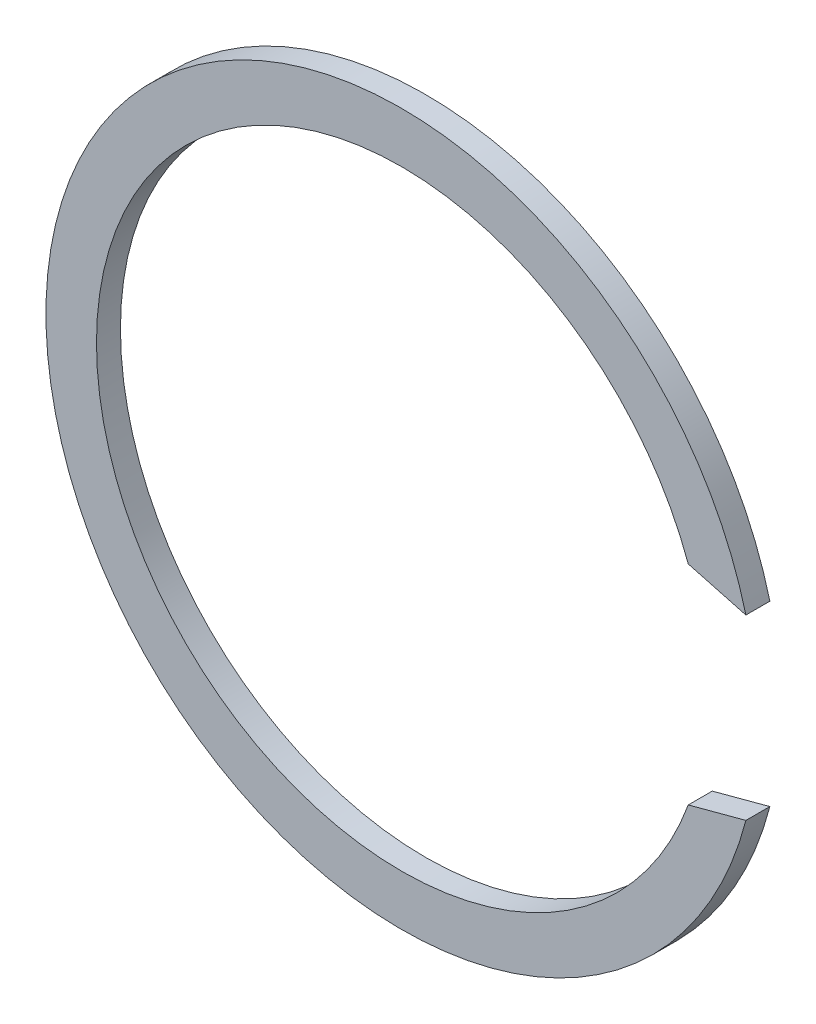
ISO-10303-21;
HEADER;
FILE_DESCRIPTION(('STEP AP214'),'2;1');
FILE_NAME('part.step','',(''),(''),'','','');
FILE_SCHEMA(('AUTOMOTIVE_DESIGN { 1 0 10303 214 1 1 1 1 }'));
ENDSEC;
DATA;
#1=APPLICATION_CONTEXT('core data for automotive mechanical design processes');
#2=APPLICATION_PROTOCOL_DEFINITION('international standard','automotive_design',2000,#1);
#3=PRODUCT_CONTEXT('',#1,'mechanical');
#4=PRODUCT('Part','Part','',(#3));
#5=PRODUCT_RELATED_PRODUCT_CATEGORY('part','',(#4));
#6=PRODUCT_DEFINITION_FORMATION('','',#4);
#7=PRODUCT_DEFINITION_CONTEXT('part definition',#1,'design');
#8=PRODUCT_DEFINITION('design','',#6,#7);
#9=PRODUCT_DEFINITION_SHAPE('','',#8);
#10=(LENGTH_UNIT() NAMED_UNIT(*) SI_UNIT(.MILLI.,.METRE.));
#11=(NAMED_UNIT(*) PLANE_ANGLE_UNIT() SI_UNIT($,.RADIAN.));
#12=(NAMED_UNIT(*) SI_UNIT($,.STERADIAN.) SOLID_ANGLE_UNIT());
#13=UNCERTAINTY_MEASURE_WITH_UNIT(LENGTH_MEASURE(1.E-05),#10,'distance_accuracy_value','');
#14=(GEOMETRIC_REPRESENTATION_CONTEXT(3) GLOBAL_UNCERTAINTY_ASSIGNED_CONTEXT((#13)) GLOBAL_UNIT_ASSIGNED_CONTEXT((#10,
#11,#12)) REPRESENTATION_CONTEXT('',''));
#15=CARTESIAN_POINT('',(0.,0.,0.));
#16=DIRECTION('',(0.,0.,1.));
#17=DIRECTION('',(1.,0.,0.));
#18=AXIS2_PLACEMENT_3D('',#15,#16,#17);
#19=CARTESIAN_POINT('',(0.,0.,1.205));
#20=DIRECTION('',(0.,0.,-1.));
#21=DIRECTION('',(-1.,0.,0.));
#22=AXIS2_PLACEMENT_3D('',#19,#20,#21);
#23=CYLINDRICAL_SURFACE('',#22,35.755);
#24=CARTESIAN_POINT('',(0.,0.,-1.205));
#25=DIRECTION('',(0.,0.,1.));
#26=DIRECTION('',(1.,0.,0.));
#27=AXIS2_PLACEMENT_3D('',#24,#25,#26);
#28=CIRCLE('',#27,35.755);
#29=CARTESIAN_POINT('',(34.6196298859115,8.93875,-1.205));
#30=VERTEX_POINT('',#29);
#31=CARTESIAN_POINT('',(34.6196298859115,-8.93875,-1.205));
#32=VERTEX_POINT('',#31);
#33=EDGE_CURVE('E97',#30,#32,#28,.T.);
#34=ORIENTED_EDGE('',*,*,#33,.T.);
#35=DIRECTION('',(0.,0.,-1.));
#36=VECTOR('',#35,1.);
#37=CARTESIAN_POINT('',(34.6196298859115,-8.93875,1.205));
#38=LINE('',#37,#36);
#39=CARTESIAN_POINT('',(34.6196298859115,-8.93875,1.205));
#40=VERTEX_POINT('',#39);
#41=EDGE_CURVE('E11',#40,#32,#38,.T.);
#42=ORIENTED_EDGE('',*,*,#41,.F.);
#43=CARTESIAN_POINT('',(0.,0.,1.205));
#44=DIRECTION('',(0.,0.,1.));
#45=DIRECTION('',(1.,0.,0.));
#46=AXIS2_PLACEMENT_3D('',#43,#44,#45);
#47=CIRCLE('',#46,35.755);
#48=CARTESIAN_POINT('',(34.6196298859115,8.93875,1.205));
#49=VERTEX_POINT('',#48);
#50=EDGE_CURVE('E85',#49,#40,#47,.T.);
#51=ORIENTED_EDGE('',*,*,#50,.F.);
#52=DIRECTION('',(0.,0.,-1.));
#53=VECTOR('',#52,1.);
#54=CARTESIAN_POINT('',(34.6196298859115,8.93875,1.205));
#55=LINE('',#54,#53);
#56=EDGE_CURVE('E93',#49,#30,#55,.T.);
#57=ORIENTED_EDGE('',*,*,#56,.T.);
#58=EDGE_LOOP('',(#34,#42,#51,#57));
#59=FACE_BOUND('',#58,.T.);
#60=ADVANCED_FACE('F34',(#59),#23,.T.);
#61=CARTESIAN_POINT('',(34.6196298859115,-8.93875,1.205));
#62=DIRECTION('',(0.258819045102514,-0.96592582628907,0.));
#63=DIRECTION('',(0.96592582628907,0.258819045102514,0.));
#64=AXIS2_PLACEMENT_3D('',#61,#62,#63);
#65=PLANE('',#64);
#66=DIRECTION('',(-0.96592582628907,-0.258819045102514,0.));
#67=VECTOR('',#66,1.);
#68=CARTESIAN_POINT('',(34.6196298859115,-8.93875,-1.205));
#69=LINE('',#68,#67);
#70=CARTESIAN_POINT('',(28.8250995998043,-10.4913897106801,-1.205));
#71=VERTEX_POINT('',#70);
#72=EDGE_CURVE('E89',#32,#71,#69,.T.);
#73=ORIENTED_EDGE('',*,*,#72,.T.);
#74=DIRECTION('',(0.,0.,-1.));
#75=VECTOR('',#74,1.);
#76=CARTESIAN_POINT('',(28.8250995998043,-10.4913897106801,1.205));
#77=LINE('',#76,#75);
#78=CARTESIAN_POINT('',(28.8250995998043,-10.4913897106801,1.205));
#79=VERTEX_POINT('',#78);
#80=EDGE_CURVE('E42',#79,#71,#77,.T.);
#81=ORIENTED_EDGE('',*,*,#80,.F.);
#82=DIRECTION('',(-0.96592582628907,-0.258819045102514,0.));
#83=VECTOR('',#82,1.);
#84=CARTESIAN_POINT('',(34.6196298859115,-8.93875,1.205));
#85=LINE('',#84,#83);
#86=EDGE_CURVE('E80',#40,#79,#85,.T.);
#87=ORIENTED_EDGE('',*,*,#86,.F.);
#88=ORIENTED_EDGE('',*,*,#41,.T.);
#89=EDGE_LOOP('',(#73,#81,#87,#88));
#90=FACE_BOUND('',#89,.T.);
#91=ADVANCED_FACE('F88',(#90),#65,.F.);
#92=CARTESIAN_POINT('',(0.,0.,1.205));
#93=DIRECTION('',(0.,0.,-1.));
#94=DIRECTION('',(-1.,0.,0.));
#95=AXIS2_PLACEMENT_3D('',#92,#93,#94);
#96=CYLINDRICAL_SURFACE('',#95,30.675);
#97=CARTESIAN_POINT('',(0.,0.,-1.205));
#98=DIRECTION('',(0.,0.,-1.));
#99=DIRECTION('',(1.,0.,0.));
#100=AXIS2_PLACEMENT_3D('',#97,#98,#99);
#101=CIRCLE('',#100,30.675);
#102=CARTESIAN_POINT('',(28.8250995998043,10.4913897106801,-1.205));
#103=VERTEX_POINT('',#102);
#104=EDGE_CURVE('E67',#71,#103,#101,.T.);
#105=ORIENTED_EDGE('',*,*,#104,.T.);
#106=DIRECTION('',(0.,0.,-1.));
#107=VECTOR('',#106,1.);
#108=CARTESIAN_POINT('',(28.8250995998043,10.4913897106801,1.205));
#109=LINE('',#108,#107);
#110=CARTESIAN_POINT('',(28.8250995998043,10.4913897106801,1.205));
#111=VERTEX_POINT('',#110);
#112=EDGE_CURVE('E90',#111,#103,#109,.T.);
#113=ORIENTED_EDGE('',*,*,#112,.F.);
#114=CARTESIAN_POINT('',(0.,0.,1.205));
#115=DIRECTION('',(0.,0.,-1.));
#116=DIRECTION('',(1.,0.,0.));
#117=AXIS2_PLACEMENT_3D('',#114,#115,#116);
#118=CIRCLE('',#117,30.675);
#119=EDGE_CURVE('E83',#79,#111,#118,.T.);
#120=ORIENTED_EDGE('',*,*,#119,.F.);
#121=ORIENTED_EDGE('',*,*,#80,.T.);
#122=EDGE_LOOP('',(#105,#113,#120,#121));
#123=FACE_BOUND('',#122,.T.);
#124=ADVANCED_FACE('F91',(#123),#96,.F.);
#125=CARTESIAN_POINT('',(34.6196298859115,8.93875,1.205));
#126=DIRECTION('',(0.258819045102514,0.96592582628907,0.));
#127=DIRECTION('',(-0.96592582628907,0.258819045102514,0.));
#128=AXIS2_PLACEMENT_3D('',#125,#126,#127);
#129=PLANE('',#128);
#130=DIRECTION('',(0.96592582628907,-0.258819045102514,0.));
#131=VECTOR('',#130,1.);
#132=CARTESIAN_POINT('',(34.6196298859115,8.93875,-1.205));
#133=LINE('',#132,#131);
#134=EDGE_CURVE('E73',#103,#30,#133,.T.);
#135=ORIENTED_EDGE('',*,*,#134,.T.);
#136=ORIENTED_EDGE('',*,*,#56,.F.);
#137=DIRECTION('',(0.96592582628907,-0.258819045102514,0.));
#138=VECTOR('',#137,1.);
#139=CARTESIAN_POINT('',(34.6196298859115,8.93875,1.205));
#140=LINE('',#139,#138);
#141=EDGE_CURVE('E50',#111,#49,#140,.T.);
#142=ORIENTED_EDGE('',*,*,#141,.F.);
#143=ORIENTED_EDGE('',*,*,#112,.T.);
#144=EDGE_LOOP('',(#135,#136,#142,#143));
#145=FACE_BOUND('',#144,.T.);
#146=ADVANCED_FACE('F104',(#145),#129,.F.);
#147=CARTESIAN_POINT('',(0.,0.,1.205));
#148=DIRECTION('',(0.,0.,1.));
#149=DIRECTION('',(1.,0.,0.));
#150=AXIS2_PLACEMENT_3D('',#147,#148,#149);
#151=PLANE('',#150);
#152=ORIENTED_EDGE('',*,*,#50,.T.);
#153=ORIENTED_EDGE('',*,*,#86,.T.);
#154=ORIENTED_EDGE('',*,*,#119,.T.);
#155=ORIENTED_EDGE('',*,*,#141,.T.);
#156=EDGE_LOOP('',(#152,#153,#154,#155));
#157=FACE_BOUND('',#156,.T.);
#158=ADVANCED_FACE('F81',(#157),#151,.T.);
#159=CARTESIAN_POINT('',(0.,0.,-1.205));
#160=DIRECTION('',(0.,0.,1.));
#161=DIRECTION('',(1.,0.,0.));
#162=AXIS2_PLACEMENT_3D('',#159,#160,#161);
#163=PLANE('',#162);
#164=ORIENTED_EDGE('',*,*,#33,.F.);
#165=ORIENTED_EDGE('',*,*,#134,.F.);
#166=ORIENTED_EDGE('',*,*,#104,.F.);
#167=ORIENTED_EDGE('',*,*,#72,.F.);
#168=EDGE_LOOP('',(#164,#165,#166,#167));
#169=FACE_BOUND('',#168,.T.);
#170=ADVANCED_FACE('F107',(#169),#163,.F.);
#171=CLOSED_SHELL('',(#60,#91,#124,#146,#158,#170));
#172=MANIFOLD_SOLID_BREP('B2',#171);
#173=ADVANCED_BREP_SHAPE_REPRESENTATION('',(#18,#172),#14);
#174=SHAPE_DEFINITION_REPRESENTATION(#9,#173);
ENDSEC;
END-ISO-10303-21;
